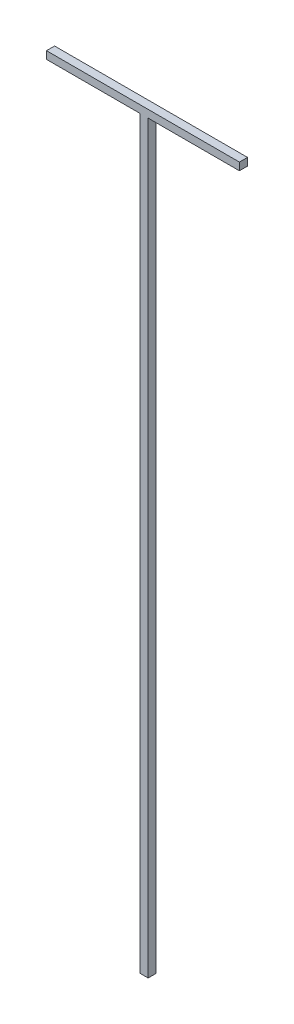
ISO-10303-21;
HEADER;
FILE_DESCRIPTION(('STEP AP214'),'2;1');
FILE_NAME('part.step','',(''),(''),'','','');
FILE_SCHEMA(('AUTOMOTIVE_DESIGN { 1 0 10303 214 1 1 1 1 }'));
ENDSEC;
DATA;
#1=APPLICATION_CONTEXT('core data for automotive mechanical design processes');
#2=APPLICATION_PROTOCOL_DEFINITION('international standard','automotive_design',2000,#1);
#3=PRODUCT_CONTEXT('',#1,'mechanical');
#4=PRODUCT('Part','Part','',(#3));
#5=PRODUCT_RELATED_PRODUCT_CATEGORY('part','',(#4));
#6=PRODUCT_DEFINITION_FORMATION('','',#4);
#7=PRODUCT_DEFINITION_CONTEXT('part definition',#1,'design');
#8=PRODUCT_DEFINITION('design','',#6,#7);
#9=PRODUCT_DEFINITION_SHAPE('','',#8);
#10=(LENGTH_UNIT() NAMED_UNIT(*) SI_UNIT(.MILLI.,.METRE.));
#11=(NAMED_UNIT(*) PLANE_ANGLE_UNIT() SI_UNIT($,.RADIAN.));
#12=(NAMED_UNIT(*) SI_UNIT($,.STERADIAN.) SOLID_ANGLE_UNIT());
#13=UNCERTAINTY_MEASURE_WITH_UNIT(LENGTH_MEASURE(1.E-05),#10,'distance_accuracy_value','');
#14=(GEOMETRIC_REPRESENTATION_CONTEXT(3) GLOBAL_UNCERTAINTY_ASSIGNED_CONTEXT((#13)) GLOBAL_UNIT_ASSIGNED_CONTEXT((#10,
#11,#12)) REPRESENTATION_CONTEXT('',''));
#15=CARTESIAN_POINT('',(0.,0.,0.));
#16=DIRECTION('',(0.,0.,1.));
#17=DIRECTION('',(1.,0.,0.));
#18=AXIS2_PLACEMENT_3D('',#15,#16,#17);
#19=CARTESIAN_POINT('',(50.0967978991557,31.5092960432226,10.));
#20=DIRECTION('',(1.,0.,0.));
#21=DIRECTION('',(0.,1.,0.));
#22=AXIS2_PLACEMENT_3D('',#19,#20,#21);
#23=PLANE('',#22);
#24=DIRECTION('',(0.,-1.,0.));
#25=VECTOR('',#24,1.);
#26=CARTESIAN_POINT('',(50.0967978991557,31.5092960432226,0.));
#27=LINE('',#26,#25);
#28=CARTESIAN_POINT('',(50.0967978991557,31.5092960432226,0.));
#29=VERTEX_POINT('',#28);
#30=CARTESIAN_POINT('',(50.0967978991558,-887.447750082247,0.));
#31=VERTEX_POINT('',#30);
#32=EDGE_CURVE('E138',#29,#31,#27,.T.);
#33=ORIENTED_EDGE('',*,*,#32,.T.);
#34=DIRECTION('',(0.,0.,-1.));
#35=VECTOR('',#34,1.);
#36=CARTESIAN_POINT('',(50.0967978991558,-887.447750082247,10.));
#37=LINE('',#36,#35);
#38=CARTESIAN_POINT('',(50.0967978991558,-887.447750082247,10.));
#39=VERTEX_POINT('',#38);
#40=EDGE_CURVE('E45',#39,#31,#37,.T.);
#41=ORIENTED_EDGE('',*,*,#40,.F.);
#42=DIRECTION('',(0.,-1.,0.));
#43=VECTOR('',#42,1.);
#44=CARTESIAN_POINT('',(50.0967978991557,31.5092960432226,10.));
#45=LINE('',#44,#43);
#46=CARTESIAN_POINT('',(50.0967978991557,31.5092960432226,10.));
#47=VERTEX_POINT('',#46);
#48=EDGE_CURVE('E141',#47,#39,#45,.T.);
#49=ORIENTED_EDGE('',*,*,#48,.F.);
#50=DIRECTION('',(0.,0.,-1.));
#51=VECTOR('',#50,1.);
#52=CARTESIAN_POINT('',(50.0967978991557,31.5092960432226,10.));
#53=LINE('',#52,#51);
#54=EDGE_CURVE('E11',#47,#29,#53,.T.);
#55=ORIENTED_EDGE('',*,*,#54,.T.);
#56=EDGE_LOOP('',(#33,#41,#49,#55));
#57=FACE_BOUND('',#56,.T.);
#58=ADVANCED_FACE('F35',(#57),#23,.F.);
#59=CARTESIAN_POINT('',(50.0967978991558,-887.447750082247,10.));
#60=DIRECTION('',(0.,1.,0.));
#61=DIRECTION('',(0.,0.,1.));
#62=AXIS2_PLACEMENT_3D('',#59,#60,#61);
#63=PLANE('',#62);
#64=DIRECTION('',(1.,0.,0.));
#65=VECTOR('',#64,1.);
#66=CARTESIAN_POINT('',(50.0967978991558,-887.447750082247,0.));
#67=LINE('',#66,#65);
#68=CARTESIAN_POINT('',(60.0967978991557,-887.447750082247,0.));
#69=VERTEX_POINT('',#68);
#70=EDGE_CURVE('E132',#31,#69,#67,.T.);
#71=ORIENTED_EDGE('',*,*,#70,.T.);
#72=DIRECTION('',(0.,0.,-1.));
#73=VECTOR('',#72,1.);
#74=CARTESIAN_POINT('',(60.0967978991557,-887.447750082247,10.));
#75=LINE('',#74,#73);
#76=CARTESIAN_POINT('',(60.0967978991557,-887.447750082247,10.));
#77=VERTEX_POINT('',#76);
#78=EDGE_CURVE('E148',#77,#69,#75,.T.);
#79=ORIENTED_EDGE('',*,*,#78,.F.);
#80=DIRECTION('',(1.,0.,0.));
#81=VECTOR('',#80,1.);
#82=CARTESIAN_POINT('',(50.0967978991558,-887.447750082247,10.));
#83=LINE('',#82,#81);
#84=EDGE_CURVE('E173',#39,#77,#83,.T.);
#85=ORIENTED_EDGE('',*,*,#84,.F.);
#86=ORIENTED_EDGE('',*,*,#40,.T.);
#87=EDGE_LOOP('',(#71,#79,#85,#86));
#88=FACE_BOUND('',#87,.T.);
#89=ADVANCED_FACE('F167',(#88),#63,.F.);
#90=CARTESIAN_POINT('',(60.0967978991555,31.5092960432226,10.));
#91=DIRECTION('',(1.,0.,0.));
#92=DIRECTION('',(0.,1.,0.));
#93=AXIS2_PLACEMENT_3D('',#90,#91,#92);
#94=PLANE('',#93);
#95=DIRECTION('',(0.,-1.,0.));
#96=VECTOR('',#95,1.);
#97=CARTESIAN_POINT('',(60.0967978991555,31.5092960432226,0.));
#98=LINE('',#97,#96);
#99=CARTESIAN_POINT('',(60.0967978991555,31.5092960432226,0.));
#100=VERTEX_POINT('',#99);
#101=EDGE_CURVE('E130',#100,#69,#98,.T.);
#102=ORIENTED_EDGE('',*,*,#101,.F.);
#103=DIRECTION('',(0.,0.,-1.));
#104=VECTOR('',#103,1.);
#105=CARTESIAN_POINT('',(60.0967978991555,31.5092960432226,10.));
#106=LINE('',#105,#104);
#107=CARTESIAN_POINT('',(60.0967978991555,31.5092960432226,10.));
#108=VERTEX_POINT('',#107);
#109=EDGE_CURVE('E150',#108,#100,#106,.T.);
#110=ORIENTED_EDGE('',*,*,#109,.F.);
#111=DIRECTION('',(0.,-1.,0.));
#112=VECTOR('',#111,1.);
#113=CARTESIAN_POINT('',(60.0967978991555,31.5092960432226,10.));
#114=LINE('',#113,#112);
#115=EDGE_CURVE('E144',#108,#77,#114,.T.);
#116=ORIENTED_EDGE('',*,*,#115,.T.);
#117=ORIENTED_EDGE('',*,*,#78,.T.);
#118=EDGE_LOOP('',(#102,#110,#116,#117));
#119=FACE_BOUND('',#118,.T.);
#120=ADVANCED_FACE('F161',(#119),#94,.T.);
#121=CARTESIAN_POINT('',(0.,0.,10.));
#122=DIRECTION('',(0.,0.,-1.));
#123=DIRECTION('',(-1.,0.,0.));
#124=AXIS2_PLACEMENT_3D('',#121,#122,#123);
#125=PLANE('',#124);
#126=ORIENTED_EDGE('',*,*,#115,.F.);
#127=DIRECTION('',(1.,0.,0.));
#128=VECTOR('',#127,1.);
#129=CARTESIAN_POINT('',(-65.3526140155729,31.5092960432226,10.));
#130=LINE('',#129,#128);
#131=CARTESIAN_POINT('',(172.717622755443,31.5092960432226,10.));
#132=VERTEX_POINT('',#131);
#133=EDGE_CURVE('E120',#108,#132,#130,.T.);
#134=ORIENTED_EDGE('',*,*,#133,.T.);
#135=DIRECTION('',(0.,-1.,0.));
#136=VECTOR('',#135,1.);
#137=CARTESIAN_POINT('',(172.717622755443,40.8453837597331,10.));
#138=LINE('',#137,#136);
#139=CARTESIAN_POINT('',(172.717622755443,40.8453837597331,10.));
#140=VERTEX_POINT('',#139);
#141=EDGE_CURVE('E154',#140,#132,#138,.T.);
#142=ORIENTED_EDGE('',*,*,#141,.F.);
#143=DIRECTION('',(1.,0.,0.));
#144=VECTOR('',#143,1.);
#145=CARTESIAN_POINT('',(-65.3526140155729,40.8453837597331,10.));
#146=LINE('',#145,#144);
#147=CARTESIAN_POINT('',(-65.3526140155729,40.8453837597331,10.));
#148=VERTEX_POINT('',#147);
#149=EDGE_CURVE('E105',#148,#140,#146,.T.);
#150=ORIENTED_EDGE('',*,*,#149,.F.);
#151=DIRECTION('',(0.,-1.,0.));
#152=VECTOR('',#151,1.);
#153=CARTESIAN_POINT('',(-65.3526140155729,40.8453837597331,10.));
#154=LINE('',#153,#152);
#155=CARTESIAN_POINT('',(-65.3526140155729,31.5092960432226,10.));
#156=VERTEX_POINT('',#155);
#157=EDGE_CURVE('E103',#148,#156,#154,.T.);
#158=ORIENTED_EDGE('',*,*,#157,.T.);
#159=EDGE_CURVE('E152',#156,#47,#130,.T.);
#160=ORIENTED_EDGE('',*,*,#159,.T.);
#161=ORIENTED_EDGE('',*,*,#48,.T.);
#162=ORIENTED_EDGE('',*,*,#84,.T.);
#163=EDGE_LOOP('',(#126,#134,#142,#150,#158,#160,#161,#162));
#164=FACE_BOUND('',#163,.T.);
#165=ADVANCED_FACE('F175',(#164),#125,.F.);
#166=CARTESIAN_POINT('',(0.,0.,0.));
#167=DIRECTION('',(0.,0.,-1.));
#168=DIRECTION('',(-1.,0.,0.));
#169=AXIS2_PLACEMENT_3D('',#166,#167,#168);
#170=PLANE('',#169);
#171=ORIENTED_EDGE('',*,*,#32,.F.);
#172=DIRECTION('',(1.,0.,0.));
#173=VECTOR('',#172,1.);
#174=CARTESIAN_POINT('',(-65.3526140155729,31.5092960432226,0.));
#175=LINE('',#174,#173);
#176=CARTESIAN_POINT('',(-65.3526140155729,31.5092960432226,0.));
#177=VERTEX_POINT('',#176);
#178=EDGE_CURVE('E113',#177,#29,#175,.T.);
#179=ORIENTED_EDGE('',*,*,#178,.F.);
#180=DIRECTION('',(0.,-1.,0.));
#181=VECTOR('',#180,1.);
#182=CARTESIAN_POINT('',(-65.3526140155729,40.8453837597331,0.));
#183=LINE('',#182,#181);
#184=CARTESIAN_POINT('',(-65.3526140155729,40.8453837597331,0.));
#185=VERTEX_POINT('',#184);
#186=EDGE_CURVE('E101',#185,#177,#183,.T.);
#187=ORIENTED_EDGE('',*,*,#186,.F.);
#188=DIRECTION('',(1.,0.,0.));
#189=VECTOR('',#188,1.);
#190=CARTESIAN_POINT('',(-65.3526140155729,40.8453837597331,0.));
#191=LINE('',#190,#189);
#192=CARTESIAN_POINT('',(172.717622755443,40.8453837597331,0.));
#193=VERTEX_POINT('',#192);
#194=EDGE_CURVE('E112',#185,#193,#191,.T.);
#195=ORIENTED_EDGE('',*,*,#194,.T.);
#196=DIRECTION('',(0.,-1.,0.));
#197=VECTOR('',#196,1.);
#198=CARTESIAN_POINT('',(172.717622755443,40.8453837597331,0.));
#199=LINE('',#198,#197);
#200=CARTESIAN_POINT('',(172.717622755443,31.5092960432226,0.));
#201=VERTEX_POINT('',#200);
#202=EDGE_CURVE('E118',#193,#201,#199,.T.);
#203=ORIENTED_EDGE('',*,*,#202,.T.);
#204=EDGE_CURVE('E115',#100,#201,#175,.T.);
#205=ORIENTED_EDGE('',*,*,#204,.F.);
#206=ORIENTED_EDGE('',*,*,#101,.T.);
#207=ORIENTED_EDGE('',*,*,#70,.F.);
#208=EDGE_LOOP('',(#171,#179,#187,#195,#203,#205,#206,#207));
#209=FACE_BOUND('',#208,.T.);
#210=ADVANCED_FACE('F110',(#209),#170,.T.);
#211=CARTESIAN_POINT('',(-65.3526140155729,40.8453837597331,10.));
#212=DIRECTION('',(0.,1.,0.));
#213=DIRECTION('',(0.,0.,1.));
#214=AXIS2_PLACEMENT_3D('',#211,#212,#213);
#215=PLANE('',#214);
#216=ORIENTED_EDGE('',*,*,#194,.F.);
#217=DIRECTION('',(0.,0.,-1.));
#218=VECTOR('',#217,1.);
#219=CARTESIAN_POINT('',(-65.3526140155729,40.8453837597331,10.));
#220=LINE('',#219,#218);
#221=EDGE_CURVE('E98',#148,#185,#220,.T.);
#222=ORIENTED_EDGE('',*,*,#221,.F.);
#223=ORIENTED_EDGE('',*,*,#149,.T.);
#224=DIRECTION('',(0.,0.,-1.));
#225=VECTOR('',#224,1.);
#226=CARTESIAN_POINT('',(172.717622755443,40.8453837597331,10.));
#227=LINE('',#226,#225);
#228=EDGE_CURVE('E92',#140,#193,#227,.T.);
#229=ORIENTED_EDGE('',*,*,#228,.T.);
#230=EDGE_LOOP('',(#216,#222,#223,#229));
#231=FACE_BOUND('',#230,.T.);
#232=ADVANCED_FACE('F117',(#231),#215,.T.);
#233=CARTESIAN_POINT('',(-65.3526140155729,40.8453837597331,10.));
#234=DIRECTION('',(1.,0.,0.));
#235=DIRECTION('',(0.,0.,-1.));
#236=AXIS2_PLACEMENT_3D('',#233,#234,#235);
#237=PLANE('',#236);
#238=ORIENTED_EDGE('',*,*,#186,.T.);
#239=DIRECTION('',(0.,0.,-1.));
#240=VECTOR('',#239,1.);
#241=CARTESIAN_POINT('',(-65.3526140155729,31.5092960432226,10.));
#242=LINE('',#241,#240);
#243=EDGE_CURVE('E39',#156,#177,#242,.T.);
#244=ORIENTED_EDGE('',*,*,#243,.F.);
#245=ORIENTED_EDGE('',*,*,#157,.F.);
#246=ORIENTED_EDGE('',*,*,#221,.T.);
#247=EDGE_LOOP('',(#238,#244,#245,#246));
#248=FACE_BOUND('',#247,.T.);
#249=ADVANCED_FACE('F37',(#248),#237,.F.);
#250=CARTESIAN_POINT('',(172.717622755443,40.8453837597331,10.));
#251=DIRECTION('',(1.,0.,0.));
#252=DIRECTION('',(0.,0.,-1.));
#253=AXIS2_PLACEMENT_3D('',#250,#251,#252);
#254=PLANE('',#253);
#255=ORIENTED_EDGE('',*,*,#202,.F.);
#256=ORIENTED_EDGE('',*,*,#228,.F.);
#257=ORIENTED_EDGE('',*,*,#141,.T.);
#258=DIRECTION('',(0.,0.,-1.));
#259=VECTOR('',#258,1.);
#260=CARTESIAN_POINT('',(172.717622755443,31.5092960432226,10.));
#261=LINE('',#260,#259);
#262=EDGE_CURVE('E125',#132,#201,#261,.T.);
#263=ORIENTED_EDGE('',*,*,#262,.T.);
#264=EDGE_LOOP('',(#255,#256,#257,#263));
#265=FACE_BOUND('',#264,.T.);
#266=ADVANCED_FACE('F178',(#265),#254,.T.);
#267=CARTESIAN_POINT('',(-65.3526140155729,31.5092960432226,10.));
#268=DIRECTION('',(0.,1.,0.));
#269=DIRECTION('',(0.,0.,1.));
#270=AXIS2_PLACEMENT_3D('',#267,#268,#269);
#271=PLANE('',#270);
#272=ORIENTED_EDGE('',*,*,#133,.F.);
#273=ORIENTED_EDGE('',*,*,#109,.T.);
#274=ORIENTED_EDGE('',*,*,#204,.T.);
#275=ORIENTED_EDGE('',*,*,#262,.F.);
#276=EDGE_LOOP('',(#272,#273,#274,#275));
#277=FACE_BOUND('',#276,.T.);
#278=ADVANCED_FACE('F158',(#277),#271,.F.);
#279=ORIENTED_EDGE('',*,*,#54,.F.);
#280=ORIENTED_EDGE('',*,*,#159,.F.);
#281=ORIENTED_EDGE('',*,*,#243,.T.);
#282=ORIENTED_EDGE('',*,*,#178,.T.);
#283=EDGE_LOOP('',(#279,#280,#281,#282));
#284=FACE_BOUND('',#283,.T.);
#285=ADVANCED_FACE('F181',(#284),#271,.F.);
#286=CLOSED_SHELL('',(#58,#89,#120,#165,#210,#232,#249,#266,#278,#285));
#287=MANIFOLD_SOLID_BREP('B2',#286);
#288=ADVANCED_BREP_SHAPE_REPRESENTATION('',(#18,#287),#14);
#289=SHAPE_DEFINITION_REPRESENTATION(#9,#288);
ENDSEC;
END-ISO-10303-21;
